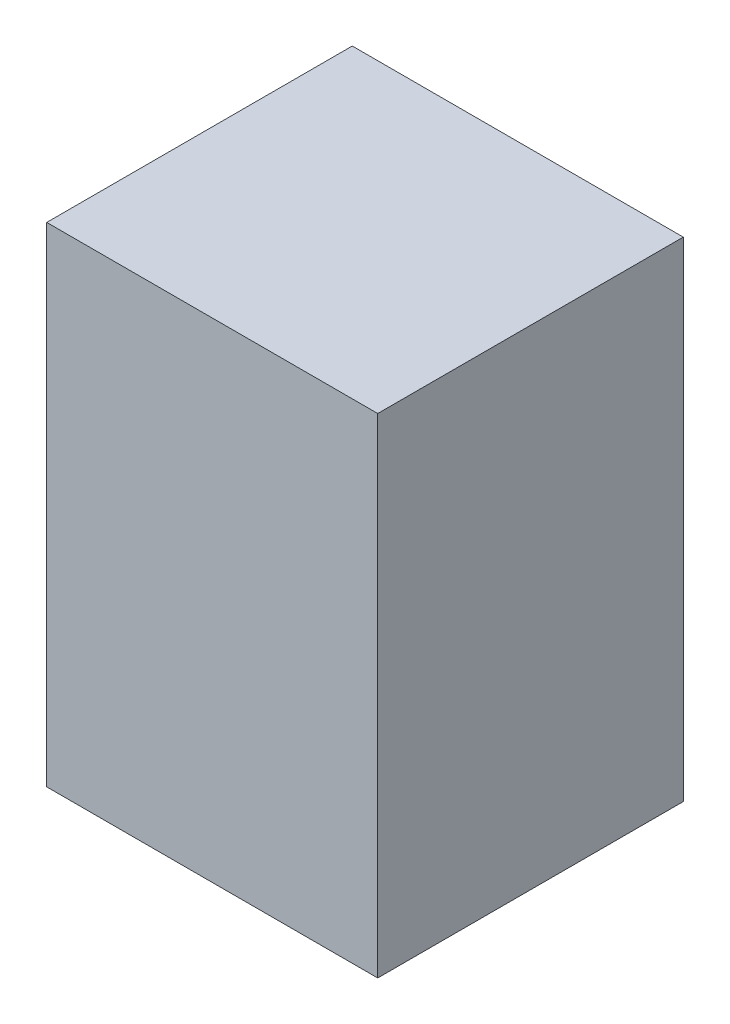
ISO-10303-21;
HEADER;
FILE_DESCRIPTION(('STEP AP214'),'2;1');
FILE_NAME('part.step','',(''),(''),'','','');
FILE_SCHEMA(('AUTOMOTIVE_DESIGN { 1 0 10303 214 1 1 1 1 }'));
ENDSEC;
DATA;
#1=APPLICATION_CONTEXT('core data for automotive mechanical design processes');
#2=APPLICATION_PROTOCOL_DEFINITION('international standard','automotive_design',2000,#1);
#3=PRODUCT_CONTEXT('',#1,'mechanical');
#4=PRODUCT('Part','Part','',(#3));
#5=PRODUCT_RELATED_PRODUCT_CATEGORY('part','',(#4));
#6=PRODUCT_DEFINITION_FORMATION('','',#4);
#7=PRODUCT_DEFINITION_CONTEXT('part definition',#1,'design');
#8=PRODUCT_DEFINITION('design','',#6,#7);
#9=PRODUCT_DEFINITION_SHAPE('','',#8);
#10=(LENGTH_UNIT() NAMED_UNIT(*) SI_UNIT(.MILLI.,.METRE.));
#11=(NAMED_UNIT(*) PLANE_ANGLE_UNIT() SI_UNIT($,.RADIAN.));
#12=(NAMED_UNIT(*) SI_UNIT($,.STERADIAN.) SOLID_ANGLE_UNIT());
#13=UNCERTAINTY_MEASURE_WITH_UNIT(LENGTH_MEASURE(1.E-05),#10,'distance_accuracy_value','');
#14=(GEOMETRIC_REPRESENTATION_CONTEXT(3) GLOBAL_UNCERTAINTY_ASSIGNED_CONTEXT((#13)) GLOBAL_UNIT_ASSIGNED_CONTEXT((#10,
#11,#12)) REPRESENTATION_CONTEXT('',''));
#15=CARTESIAN_POINT('',(0.,0.,0.));
#16=DIRECTION('',(0.,0.,1.));
#17=DIRECTION('',(1.,0.,0.));
#18=AXIS2_PLACEMENT_3D('',#15,#16,#17);
#19=CARTESIAN_POINT('',(0.,2438.4,0.));
#20=DIRECTION('',(1.,0.,0.));
#21=DIRECTION('',(0.,0.,-1.));
#22=AXIS2_PLACEMENT_3D('',#19,#20,#21);
#23=PLANE('',#22);
#24=DIRECTION('',(0.,0.,1.));
#25=VECTOR('',#24,1.);
#26=CARTESIAN_POINT('',(0.,0.,0.));
#27=LINE('',#26,#25);
#28=CARTESIAN_POINT('',(0.,0.,-1524.));
#29=VERTEX_POINT('',#28);
#30=CARTESIAN_POINT('',(0.,0.,0.));
#31=VERTEX_POINT('',#30);
#32=EDGE_CURVE('E96',#29,#31,#27,.T.);
#33=ORIENTED_EDGE('',*,*,#32,.T.);
#34=DIRECTION('',(0.,-1.,0.));
#35=VECTOR('',#34,1.);
#36=CARTESIAN_POINT('',(0.,2438.4,0.));
#37=LINE('',#36,#35);
#38=CARTESIAN_POINT('',(0.,2438.4,0.));
#39=VERTEX_POINT('',#38);
#40=EDGE_CURVE('E11',#39,#31,#37,.T.);
#41=ORIENTED_EDGE('',*,*,#40,.F.);
#42=DIRECTION('',(0.,0.,1.));
#43=VECTOR('',#42,1.);
#44=CARTESIAN_POINT('',(0.,2438.4,0.));
#45=LINE('',#44,#43);
#46=CARTESIAN_POINT('',(0.,2438.4,-1524.));
#47=VERTEX_POINT('',#46);
#48=EDGE_CURVE('E84',#47,#39,#45,.T.);
#49=ORIENTED_EDGE('',*,*,#48,.F.);
#50=DIRECTION('',(0.,-1.,0.));
#51=VECTOR('',#50,1.);
#52=CARTESIAN_POINT('',(0.,2438.4,-1524.));
#53=LINE('',#52,#51);
#54=EDGE_CURVE('E92',#47,#29,#53,.T.);
#55=ORIENTED_EDGE('',*,*,#54,.T.);
#56=EDGE_LOOP('',(#33,#41,#49,#55));
#57=FACE_BOUND('',#56,.T.);
#58=ADVANCED_FACE('F33',(#57),#23,.F.);
#59=CARTESIAN_POINT('',(0.,2438.4,0.));
#60=DIRECTION('',(0.,0.,-1.));
#61=DIRECTION('',(-1.,0.,0.));
#62=AXIS2_PLACEMENT_3D('',#59,#60,#61);
#63=PLANE('',#62);
#64=DIRECTION('',(1.,0.,0.));
#65=VECTOR('',#64,1.);
#66=CARTESIAN_POINT('',(0.,0.,0.));
#67=LINE('',#66,#65);
#68=CARTESIAN_POINT('',(1651.,0.,0.));
#69=VERTEX_POINT('',#68);
#70=EDGE_CURVE('E88',#31,#69,#67,.T.);
#71=ORIENTED_EDGE('',*,*,#70,.T.);
#72=DIRECTION('',(0.,-1.,0.));
#73=VECTOR('',#72,1.);
#74=CARTESIAN_POINT('',(1651.,2438.4,0.));
#75=LINE('',#74,#73);
#76=CARTESIAN_POINT('',(1651.,2438.4,0.));
#77=VERTEX_POINT('',#76);
#78=EDGE_CURVE('E41',#77,#69,#75,.T.);
#79=ORIENTED_EDGE('',*,*,#78,.F.);
#80=DIRECTION('',(1.,0.,0.));
#81=VECTOR('',#80,1.);
#82=CARTESIAN_POINT('',(0.,2438.4,0.));
#83=LINE('',#82,#81);
#84=EDGE_CURVE('E79',#39,#77,#83,.T.);
#85=ORIENTED_EDGE('',*,*,#84,.F.);
#86=ORIENTED_EDGE('',*,*,#40,.T.);
#87=EDGE_LOOP('',(#71,#79,#85,#86));
#88=FACE_BOUND('',#87,.T.);
#89=ADVANCED_FACE('F87',(#88),#63,.F.);
#90=CARTESIAN_POINT('',(1651.,2438.4,0.));
#91=DIRECTION('',(-1.,0.,0.));
#92=DIRECTION('',(0.,0.,1.));
#93=AXIS2_PLACEMENT_3D('',#90,#91,#92);
#94=PLANE('',#93);
#95=DIRECTION('',(0.,0.,-1.));
#96=VECTOR('',#95,1.);
#97=CARTESIAN_POINT('',(1651.,0.,0.));
#98=LINE('',#97,#96);
#99=CARTESIAN_POINT('',(1651.,0.,-1524.));
#100=VERTEX_POINT('',#99);
#101=EDGE_CURVE('E66',#69,#100,#98,.T.);
#102=ORIENTED_EDGE('',*,*,#101,.T.);
#103=DIRECTION('',(0.,-1.,0.));
#104=VECTOR('',#103,1.);
#105=CARTESIAN_POINT('',(1651.,2438.4,-1524.));
#106=LINE('',#105,#104);
#107=CARTESIAN_POINT('',(1651.,2438.4,-1524.));
#108=VERTEX_POINT('',#107);
#109=EDGE_CURVE('E89',#108,#100,#106,.T.);
#110=ORIENTED_EDGE('',*,*,#109,.F.);
#111=DIRECTION('',(0.,0.,-1.));
#112=VECTOR('',#111,1.);
#113=CARTESIAN_POINT('',(1651.,2438.4,0.));
#114=LINE('',#113,#112);
#115=EDGE_CURVE('E82',#77,#108,#114,.T.);
#116=ORIENTED_EDGE('',*,*,#115,.F.);
#117=ORIENTED_EDGE('',*,*,#78,.T.);
#118=EDGE_LOOP('',(#102,#110,#116,#117));
#119=FACE_BOUND('',#118,.T.);
#120=ADVANCED_FACE('F90',(#119),#94,.F.);
#121=CARTESIAN_POINT('',(0.,2438.4,-1524.));
#122=DIRECTION('',(0.,0.,1.));
#123=DIRECTION('',(1.,0.,0.));
#124=AXIS2_PLACEMENT_3D('',#121,#122,#123);
#125=PLANE('',#124);
#126=DIRECTION('',(-1.,0.,0.));
#127=VECTOR('',#126,1.);
#128=CARTESIAN_POINT('',(0.,0.,-1524.));
#129=LINE('',#128,#127);
#130=EDGE_CURVE('E72',#100,#29,#129,.T.);
#131=ORIENTED_EDGE('',*,*,#130,.T.);
#132=ORIENTED_EDGE('',*,*,#54,.F.);
#133=DIRECTION('',(-1.,0.,0.));
#134=VECTOR('',#133,1.);
#135=CARTESIAN_POINT('',(0.,2438.4,-1524.));
#136=LINE('',#135,#134);
#137=EDGE_CURVE('E49',#108,#47,#136,.T.);
#138=ORIENTED_EDGE('',*,*,#137,.F.);
#139=ORIENTED_EDGE('',*,*,#109,.T.);
#140=EDGE_LOOP('',(#131,#132,#138,#139));
#141=FACE_BOUND('',#140,.T.);
#142=ADVANCED_FACE('F103',(#141),#125,.F.);
#143=CARTESIAN_POINT('',(0.,2438.4,0.));
#144=DIRECTION('',(0.,-1.,0.));
#145=DIRECTION('',(0.,0.,-1.));
#146=AXIS2_PLACEMENT_3D('',#143,#144,#145);
#147=PLANE('',#146);
#148=ORIENTED_EDGE('',*,*,#48,.T.);
#149=ORIENTED_EDGE('',*,*,#84,.T.);
#150=ORIENTED_EDGE('',*,*,#115,.T.);
#151=ORIENTED_EDGE('',*,*,#137,.T.);
#152=EDGE_LOOP('',(#148,#149,#150,#151));
#153=FACE_BOUND('',#152,.T.);
#154=ADVANCED_FACE('F80',(#153),#147,.F.);
#155=CARTESIAN_POINT('',(0.,0.,0.));
#156=DIRECTION('',(0.,-1.,0.));
#157=DIRECTION('',(0.,0.,-1.));
#158=AXIS2_PLACEMENT_3D('',#155,#156,#157);
#159=PLANE('',#158);
#160=ORIENTED_EDGE('',*,*,#32,.F.);
#161=ORIENTED_EDGE('',*,*,#130,.F.);
#162=ORIENTED_EDGE('',*,*,#101,.F.);
#163=ORIENTED_EDGE('',*,*,#70,.F.);
#164=EDGE_LOOP('',(#160,#161,#162,#163));
#165=FACE_BOUND('',#164,.T.);
#166=ADVANCED_FACE('F106',(#165),#159,.T.);
#167=CLOSED_SHELL('',(#58,#89,#120,#142,#154,#166));
#168=MANIFOLD_SOLID_BREP('B2',#167);
#169=ADVANCED_BREP_SHAPE_REPRESENTATION('',(#18,#168),#14);
#170=SHAPE_DEFINITION_REPRESENTATION(#9,#169);
ENDSEC;
END-ISO-10303-21;
